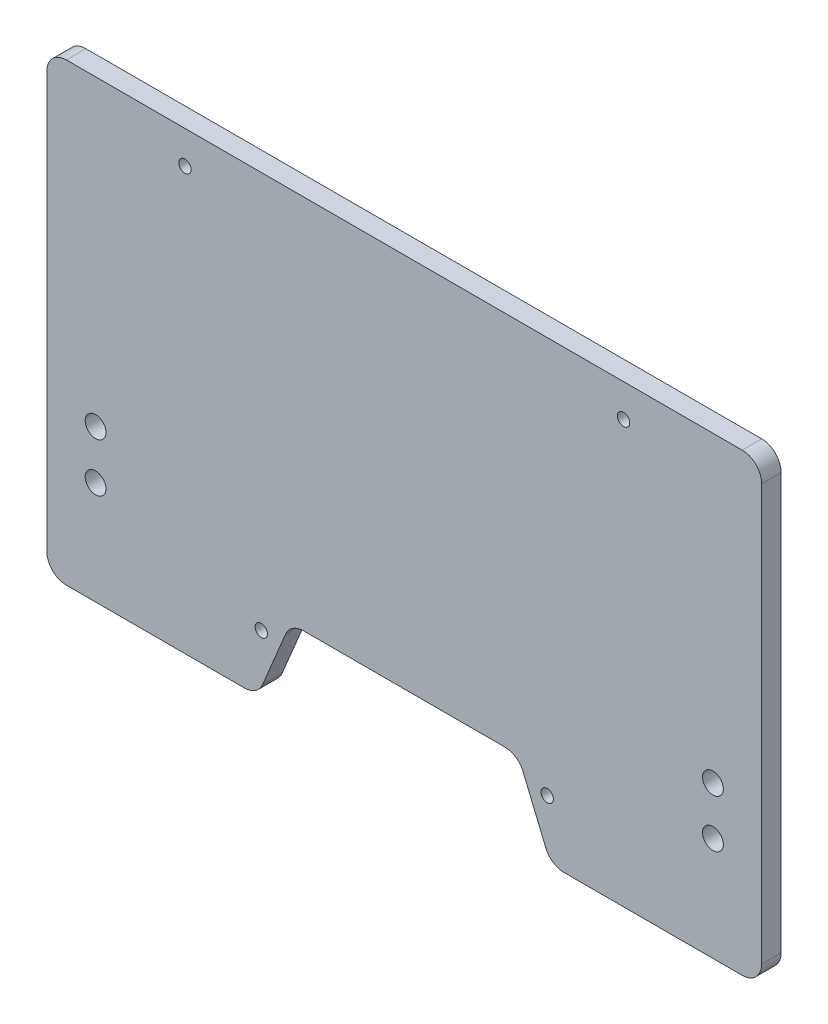
ISO-10303-21;
HEADER;
FILE_DESCRIPTION(('STEP AP214'),'2;1');
FILE_NAME('part.step','',(''),(''),'','','');
FILE_SCHEMA(('AUTOMOTIVE_DESIGN { 1 0 10303 214 1 1 1 1 }'));
ENDSEC;
DATA;
#1=APPLICATION_CONTEXT('core data for automotive mechanical design processes');
#2=APPLICATION_PROTOCOL_DEFINITION('international standard','automotive_design',2000,#1);
#3=PRODUCT_CONTEXT('',#1,'mechanical');
#4=PRODUCT('Part','Part','',(#3));
#5=PRODUCT_RELATED_PRODUCT_CATEGORY('part','',(#4));
#6=PRODUCT_DEFINITION_FORMATION('','',#4);
#7=PRODUCT_DEFINITION_CONTEXT('part definition',#1,'design');
#8=PRODUCT_DEFINITION('design','',#6,#7);
#9=PRODUCT_DEFINITION_SHAPE('','',#8);
#10=(LENGTH_UNIT() NAMED_UNIT(*) SI_UNIT(.MILLI.,.METRE.));
#11=(NAMED_UNIT(*) PLANE_ANGLE_UNIT() SI_UNIT($,.RADIAN.));
#12=(NAMED_UNIT(*) SI_UNIT($,.STERADIAN.) SOLID_ANGLE_UNIT());
#13=UNCERTAINTY_MEASURE_WITH_UNIT(LENGTH_MEASURE(1.E-05),#10,'distance_accuracy_value','');
#14=(GEOMETRIC_REPRESENTATION_CONTEXT(3) GLOBAL_UNCERTAINTY_ASSIGNED_CONTEXT((#13)) GLOBAL_UNIT_ASSIGNED_CONTEXT((#10,
#11,#12)) REPRESENTATION_CONTEXT('',''));
#15=CARTESIAN_POINT('',(0.,0.,0.));
#16=DIRECTION('',(0.,0.,1.));
#17=DIRECTION('',(1.,0.,0.));
#18=AXIS2_PLACEMENT_3D('',#15,#16,#17);
#19=CARTESIAN_POINT('',(99.5,78.1154273187962,3.));
#20=DIRECTION('',(0.,0.,-1.));
#21=DIRECTION('',(-1.,0.,0.));
#22=AXIS2_PLACEMENT_3D('',#19,#20,#21);
#23=PLANE('',#22);
#24=CARTESIAN_POINT('',(99.5,78.1154273187962,3.));
#25=DIRECTION('',(0.,0.,1.));
#26=DIRECTION('',(-1.,0.,0.));
#27=AXIS2_PLACEMENT_3D('',#24,#25,#26);
#28=CIRCLE('',#27,3.);
#29=CARTESIAN_POINT('',(102.5,78.1154273187962,3.));
#30=VERTEX_POINT('',#29);
#31=CARTESIAN_POINT('',(99.5,81.1154273187962,3.));
#32=VERTEX_POINT('',#31);
#33=EDGE_CURVE('E213',#30,#32,#28,.T.);
#34=ORIENTED_EDGE('',*,*,#33,.T.);
#35=DIRECTION('',(-1.,0.,0.));
#36=VECTOR('',#35,1.);
#37=CARTESIAN_POINT('',(-4.50000000000001,81.1154273187962,3.));
#38=LINE('',#37,#36);
#39=CARTESIAN_POINT('',(-4.50000000000001,81.1154273187962,3.));
#40=VERTEX_POINT('',#39);
#41=EDGE_CURVE('E119',#32,#40,#38,.T.);
#42=ORIENTED_EDGE('',*,*,#41,.T.);
#43=CARTESIAN_POINT('',(-4.50000000000001,78.1154273187962,3.));
#44=DIRECTION('',(0.,0.,1.));
#45=DIRECTION('',(1.,0.,0.));
#46=AXIS2_PLACEMENT_3D('',#43,#44,#45);
#47=CIRCLE('',#46,3.);
#48=CARTESIAN_POINT('',(-7.50000000000001,78.1154273187962,3.));
#49=VERTEX_POINT('',#48);
#50=EDGE_CURVE('E252',#40,#49,#47,.T.);
#51=ORIENTED_EDGE('',*,*,#50,.T.);
#52=DIRECTION('',(0.,-1.,0.));
#53=VECTOR('',#52,1.);
#54=CARTESIAN_POINT('',(-7.50000000000001,78.1154273187962,3.));
#55=LINE('',#54,#53);
#56=CARTESIAN_POINT('',(-7.5,14.1154273187962,3.));
#57=VERTEX_POINT('',#56);
#58=EDGE_CURVE('E271',#49,#57,#55,.T.);
#59=ORIENTED_EDGE('',*,*,#58,.T.);
#60=CARTESIAN_POINT('',(-4.5,14.1154273187962,3.));
#61=DIRECTION('',(0.,0.,1.));
#62=DIRECTION('',(1.,0.,0.));
#63=AXIS2_PLACEMENT_3D('',#60,#61,#62);
#64=CIRCLE('',#63,3.);
#65=CARTESIAN_POINT('',(-4.49999999999998,11.1154273187962,3.));
#66=VERTEX_POINT('',#65);
#67=EDGE_CURVE('E268',#57,#66,#64,.T.);
#68=ORIENTED_EDGE('',*,*,#67,.T.);
#69=DIRECTION('',(1.,0.,0.));
#70=VECTOR('',#69,1.);
#71=CARTESIAN_POINT('',(-4.49999999999998,11.1154273187962,3.));
#72=LINE('',#71,#70);
#73=CARTESIAN_POINT('',(22.9314636408157,11.1154273187962,3.));
#74=VERTEX_POINT('',#73);
#75=EDGE_CURVE('E270',#66,#74,#72,.T.);
#76=ORIENTED_EDGE('',*,*,#75,.T.);
#77=CARTESIAN_POINT('',(22.9314636408157,14.1154273187962,3.));
#78=DIRECTION('',(0.,0.,1.));
#79=DIRECTION('',(-1.,0.,0.));
#80=AXIS2_PLACEMENT_3D('',#77,#78,#79);
#81=CIRCLE('',#80,3.);
#82=CARTESIAN_POINT('',(25.7006944100464,12.9615811649499,3.));
#83=VERTEX_POINT('',#82);
#84=EDGE_CURVE('E273',#74,#83,#81,.T.);
#85=ORIENTED_EDGE('',*,*,#84,.T.);
#86=DIRECTION('',(0.384615384615421,0.923076923076908,0.));
#87=VECTOR('',#86,1.);
#88=CARTESIAN_POINT('',(28.2692307692299,19.1260684269896,3.));
#89=LINE('',#88,#87);
#90=CARTESIAN_POINT('',(29.2307692307699,21.4337607346855,3.));
#91=VERTEX_POINT('',#90);
#92=EDGE_CURVE('E279',#83,#91,#89,.T.);
#93=ORIENTED_EDGE('',*,*,#92,.T.);
#94=CARTESIAN_POINT('',(32.,20.2799145808375,3.));
#95=DIRECTION('',(0.,0.,-1.));
#96=DIRECTION('',(1.,0.,0.));
#97=AXIS2_PLACEMENT_3D('',#94,#95,#96);
#98=CIRCLE('',#97,3.00000000000002);
#99=CARTESIAN_POINT('',(32.,23.2799145808375,3.));
#100=VERTEX_POINT('',#99);
#101=EDGE_CURVE('E281',#91,#100,#98,.T.);
#102=ORIENTED_EDGE('',*,*,#101,.T.);
#103=DIRECTION('',(1.,0.,0.));
#104=VECTOR('',#103,1.);
#105=CARTESIAN_POINT('',(32.,23.2799145808375,3.));
#106=LINE('',#105,#104);
#107=CARTESIAN_POINT('',(63.,23.2799145808375,3.));
#108=VERTEX_POINT('',#107);
#109=EDGE_CURVE('E283',#100,#108,#106,.T.);
#110=ORIENTED_EDGE('',*,*,#109,.T.);
#111=CARTESIAN_POINT('',(63.,20.2799145808375,3.));
#112=DIRECTION('',(0.,0.,-1.));
#113=DIRECTION('',(1.,0.,0.));
#114=AXIS2_PLACEMENT_3D('',#111,#112,#113);
#115=CIRCLE('',#114,2.99999999999994);
#116=CARTESIAN_POINT('',(65.7692307692299,21.4337607346854,3.));
#117=VERTEX_POINT('',#116);
#118=EDGE_CURVE('E285',#108,#117,#115,.T.);
#119=ORIENTED_EDGE('',*,*,#118,.T.);
#120=DIRECTION('',(0.384615384615432,-0.923076923076903,0.));
#121=VECTOR('',#120,1.);
#122=CARTESIAN_POINT('',(65.7692307692299,21.4337607346854,3.));
#123=LINE('',#122,#121);
#124=CARTESIAN_POINT('',(69.2993055899535,12.9615811649499,3.));
#125=VERTEX_POINT('',#124);
#126=EDGE_CURVE('E287',#117,#125,#123,.T.);
#127=ORIENTED_EDGE('',*,*,#126,.T.);
#128=CARTESIAN_POINT('',(72.0685363591843,14.1154273187962,3.));
#129=DIRECTION('',(0.,0.,1.));
#130=DIRECTION('',(1.,0.,0.));
#131=AXIS2_PLACEMENT_3D('',#128,#129,#130);
#132=CIRCLE('',#131,3.);
#133=CARTESIAN_POINT('',(72.0685363591843,11.1154273187962,3.));
#134=VERTEX_POINT('',#133);
#135=EDGE_CURVE('E162',#125,#134,#132,.T.);
#136=ORIENTED_EDGE('',*,*,#135,.T.);
#137=DIRECTION('',(1.,0.,0.));
#138=VECTOR('',#137,1.);
#139=CARTESIAN_POINT('',(72.0685363591843,11.1154273187962,3.));
#140=LINE('',#139,#138);
#141=CARTESIAN_POINT('',(99.5,11.1154273187962,3.));
#142=VERTEX_POINT('',#141);
#143=EDGE_CURVE('E156',#134,#142,#140,.T.);
#144=ORIENTED_EDGE('',*,*,#143,.T.);
#145=CARTESIAN_POINT('',(99.5,14.1154273187962,3.));
#146=DIRECTION('',(0.,0.,1.));
#147=DIRECTION('',(1.,0.,0.));
#148=AXIS2_PLACEMENT_3D('',#145,#146,#147);
#149=CIRCLE('',#148,3.);
#150=CARTESIAN_POINT('',(102.5,14.1154273187962,3.));
#151=VERTEX_POINT('',#150);
#152=EDGE_CURVE('E160',#142,#151,#149,.T.);
#153=ORIENTED_EDGE('',*,*,#152,.T.);
#154=DIRECTION('',(0.,1.,0.));
#155=VECTOR('',#154,1.);
#156=CARTESIAN_POINT('',(102.5,78.1154273187962,3.));
#157=LINE('',#156,#155);
#158=EDGE_CURVE('E52',#151,#30,#157,.T.);
#159=ORIENTED_EDGE('',*,*,#158,.T.);
#160=EDGE_LOOP('',(#34,#42,#51,#59,#68,#76,#85,#93,#102,#110,#119,#127,#136,#144,#153,#159));
#161=FACE_BOUND('',#160,.T.);
#162=CARTESIAN_POINT('',(0.,34.4999999999959,3.));
#163=DIRECTION('',(0.,0.,1.));
#164=DIRECTION('',(1.,0.,0.));
#165=AXIS2_PLACEMENT_3D('',#162,#163,#164);
#166=CIRCLE('',#165,1.6);
#167=CARTESIAN_POINT('',(1.6,34.4999999999959,3.));
#168=VERTEX_POINT('',#167);
#169=EDGE_CURVE('E184',#168,#168,#166,.T.);
#170=ORIENTED_EDGE('',*,*,#169,.F.);
#171=EDGE_LOOP('',(#170));
#172=FACE_BOUND('',#171,.T.);
#173=CARTESIAN_POINT('',(0.,26.9999999999979,3.));
#174=DIRECTION('',(0.,0.,1.));
#175=DIRECTION('',(1.,0.,0.));
#176=AXIS2_PLACEMENT_3D('',#173,#174,#175);
#177=CIRCLE('',#176,1.6);
#178=CARTESIAN_POINT('',(1.6,26.9999999999979,3.));
#179=VERTEX_POINT('',#178);
#180=EDGE_CURVE('E390',#179,#179,#177,.T.);
#181=ORIENTED_EDGE('',*,*,#180,.F.);
#182=EDGE_LOOP('',(#181));
#183=FACE_BOUND('',#182,.T.);
#184=CARTESIAN_POINT('',(95.,34.4999999999959,3.));
#185=DIRECTION('',(0.,0.,1.));
#186=DIRECTION('',(1.,0.,0.));
#187=AXIS2_PLACEMENT_3D('',#184,#185,#186);
#188=CIRCLE('',#187,1.60000000000001);
#189=CARTESIAN_POINT('',(96.6,34.4999999999959,3.));
#190=VERTEX_POINT('',#189);
#191=EDGE_CURVE('E384',#190,#190,#188,.T.);
#192=ORIENTED_EDGE('',*,*,#191,.F.);
#193=EDGE_LOOP('',(#192));
#194=FACE_BOUND('',#193,.T.);
#195=CARTESIAN_POINT('',(95.,27.1000000000248,3.));
#196=DIRECTION('',(0.,0.,1.));
#197=DIRECTION('',(1.,0.,0.));
#198=AXIS2_PLACEMENT_3D('',#195,#196,#197);
#199=CIRCLE('',#198,1.6);
#200=CARTESIAN_POINT('',(96.6,27.1000000000248,3.));
#201=VERTEX_POINT('',#200);
#202=EDGE_CURVE('E378',#201,#201,#199,.T.);
#203=ORIENTED_EDGE('',*,*,#202,.F.);
#204=EDGE_LOOP('',(#203));
#205=FACE_BOUND('',#204,.T.);
#206=CARTESIAN_POINT('',(13.75,76.0799145808375,3.));
#207=DIRECTION('',(0.,0.,1.));
#208=DIRECTION('',(1.,0.,0.));
#209=AXIS2_PLACEMENT_3D('',#206,#207,#208);
#210=CIRCLE('',#209,0.950000000000001);
#211=CARTESIAN_POINT('',(14.7,76.0799145808375,3.));
#212=VERTEX_POINT('',#211);
#213=EDGE_CURVE('E372',#212,#212,#210,.T.);
#214=ORIENTED_EDGE('',*,*,#213,.F.);
#215=EDGE_LOOP('',(#214));
#216=FACE_BOUND('',#215,.T.);
#217=CARTESIAN_POINT('',(81.25,76.0799145808375,3.));
#218=DIRECTION('',(0.,0.,1.));
#219=DIRECTION('',(1.,0.,0.));
#220=AXIS2_PLACEMENT_3D('',#217,#218,#219);
#221=CIRCLE('',#220,0.950000000000003);
#222=CARTESIAN_POINT('',(82.2,76.0799145808375,3.));
#223=VERTEX_POINT('',#222);
#224=EDGE_CURVE('E366',#223,#223,#221,.T.);
#225=ORIENTED_EDGE('',*,*,#224,.F.);
#226=EDGE_LOOP('',(#225));
#227=FACE_BOUND('',#226,.T.);
#228=CARTESIAN_POINT('',(69.5,20.0799145808375,3.));
#229=DIRECTION('',(0.,0.,1.));
#230=DIRECTION('',(1.,0.,0.));
#231=AXIS2_PLACEMENT_3D('',#228,#229,#230);
#232=CIRCLE('',#231,0.950000000000002);
#233=CARTESIAN_POINT('',(70.45,20.0799145808375,3.));
#234=VERTEX_POINT('',#233);
#235=EDGE_CURVE('E360',#234,#234,#232,.T.);
#236=ORIENTED_EDGE('',*,*,#235,.F.);
#237=EDGE_LOOP('',(#236));
#238=FACE_BOUND('',#237,.T.);
#239=CARTESIAN_POINT('',(25.5,20.0799145808375,3.));
#240=DIRECTION('',(0.,0.,1.));
#241=DIRECTION('',(1.,0.,0.));
#242=AXIS2_PLACEMENT_3D('',#239,#240,#241);
#243=CIRCLE('',#242,0.950000000000001);
#244=CARTESIAN_POINT('',(26.45,20.0799145808375,3.));
#245=VERTEX_POINT('',#244);
#246=EDGE_CURVE('E351',#245,#245,#243,.T.);
#247=ORIENTED_EDGE('',*,*,#246,.F.);
#248=EDGE_LOOP('',(#247));
#249=FACE_BOUND('',#248,.T.);
#250=ADVANCED_FACE('F35',(#161,#172,#183,#194,#205,#216,#227,#238,#249),#23,.F.);
#251=CARTESIAN_POINT('',(99.5,78.1154273187962,0.));
#252=DIRECTION('',(0.,0.,-1.));
#253=DIRECTION('',(-1.,0.,0.));
#254=AXIS2_PLACEMENT_3D('',#251,#252,#253);
#255=PLANE('',#254);
#256=CARTESIAN_POINT('',(69.5,20.0799145808375,0.));
#257=DIRECTION('',(0.,0.,1.));
#258=DIRECTION('',(1.,0.,0.));
#259=AXIS2_PLACEMENT_3D('',#256,#257,#258);
#260=CIRCLE('',#259,0.950000000000002);
#261=CARTESIAN_POINT('',(70.45,20.0799145808375,0.));
#262=VERTEX_POINT('',#261);
#263=EDGE_CURVE('E357',#262,#262,#260,.T.);
#264=ORIENTED_EDGE('',*,*,#263,.T.);
#265=EDGE_LOOP('',(#264));
#266=FACE_BOUND('',#265,.T.);
#267=CARTESIAN_POINT('',(13.75,76.0799145808375,0.));
#268=DIRECTION('',(0.,0.,1.));
#269=DIRECTION('',(1.,0.,0.));
#270=AXIS2_PLACEMENT_3D('',#267,#268,#269);
#271=CIRCLE('',#270,0.950000000000001);
#272=CARTESIAN_POINT('',(14.7,76.0799145808375,0.));
#273=VERTEX_POINT('',#272);
#274=EDGE_CURVE('E369',#273,#273,#271,.T.);
#275=ORIENTED_EDGE('',*,*,#274,.T.);
#276=EDGE_LOOP('',(#275));
#277=FACE_BOUND('',#276,.T.);
#278=CARTESIAN_POINT('',(95.,34.4999999999959,0.));
#279=DIRECTION('',(0.,0.,1.));
#280=DIRECTION('',(1.,0.,0.));
#281=AXIS2_PLACEMENT_3D('',#278,#279,#280);
#282=CIRCLE('',#281,1.60000000000001);
#283=CARTESIAN_POINT('',(96.6,34.4999999999959,0.));
#284=VERTEX_POINT('',#283);
#285=EDGE_CURVE('E381',#284,#284,#282,.T.);
#286=ORIENTED_EDGE('',*,*,#285,.T.);
#287=EDGE_LOOP('',(#286));
#288=FACE_BOUND('',#287,.T.);
#289=CARTESIAN_POINT('',(0.,34.4999999999959,0.));
#290=DIRECTION('',(0.,0.,1.));
#291=DIRECTION('',(1.,0.,0.));
#292=AXIS2_PLACEMENT_3D('',#289,#290,#291);
#293=CIRCLE('',#292,1.6);
#294=CARTESIAN_POINT('',(1.6,34.4999999999959,0.));
#295=VERTEX_POINT('',#294);
#296=EDGE_CURVE('E393',#295,#295,#293,.T.);
#297=ORIENTED_EDGE('',*,*,#296,.T.);
#298=EDGE_LOOP('',(#297));
#299=FACE_BOUND('',#298,.T.);
#300=CARTESIAN_POINT('',(99.5,78.1154273187962,0.));
#301=DIRECTION('',(0.,0.,1.));
#302=DIRECTION('',(-1.,0.,0.));
#303=AXIS2_PLACEMENT_3D('',#300,#301,#302);
#304=CIRCLE('',#303,3.);
#305=CARTESIAN_POINT('',(102.5,78.1154273187962,0.));
#306=VERTEX_POINT('',#305);
#307=CARTESIAN_POINT('',(99.5,81.1154273187962,0.));
#308=VERTEX_POINT('',#307);
#309=EDGE_CURVE('E180',#306,#308,#304,.T.);
#310=ORIENTED_EDGE('',*,*,#309,.F.);
#311=DIRECTION('',(0.,1.,0.));
#312=VECTOR('',#311,1.);
#313=CARTESIAN_POINT('',(102.5,78.1154273187962,0.));
#314=LINE('',#313,#312);
#315=CARTESIAN_POINT('',(102.5,14.1154273187962,0.));
#316=VERTEX_POINT('',#315);
#317=EDGE_CURVE('E111',#316,#306,#314,.T.);
#318=ORIENTED_EDGE('',*,*,#317,.F.);
#319=CARTESIAN_POINT('',(99.5,14.1154273187962,0.));
#320=DIRECTION('',(0.,0.,1.));
#321=DIRECTION('',(1.,0.,0.));
#322=AXIS2_PLACEMENT_3D('',#319,#320,#321);
#323=CIRCLE('',#322,3.);
#324=CARTESIAN_POINT('',(99.5,11.1154273187962,0.));
#325=VERTEX_POINT('',#324);
#326=EDGE_CURVE('E105',#325,#316,#323,.T.);
#327=ORIENTED_EDGE('',*,*,#326,.F.);
#328=DIRECTION('',(1.,0.,0.));
#329=VECTOR('',#328,1.);
#330=CARTESIAN_POINT('',(72.0685363591843,11.1154273187962,0.));
#331=LINE('',#330,#329);
#332=CARTESIAN_POINT('',(72.0685363591843,11.1154273187962,0.));
#333=VERTEX_POINT('',#332);
#334=EDGE_CURVE('E170',#333,#325,#331,.T.);
#335=ORIENTED_EDGE('',*,*,#334,.F.);
#336=CARTESIAN_POINT('',(72.0685363591843,14.1154273187962,0.));
#337=DIRECTION('',(0.,0.,1.));
#338=DIRECTION('',(1.,0.,0.));
#339=AXIS2_PLACEMENT_3D('',#336,#337,#338);
#340=CIRCLE('',#339,3.);
#341=CARTESIAN_POINT('',(69.2993055899535,12.9615811649499,0.));
#342=VERTEX_POINT('',#341);
#343=EDGE_CURVE('E208',#342,#333,#340,.T.);
#344=ORIENTED_EDGE('',*,*,#343,.F.);
#345=DIRECTION('',(0.384615384615432,-0.923076923076903,0.));
#346=VECTOR('',#345,1.);
#347=CARTESIAN_POINT('',(66.7307692307682,19.1260684269938,0.));
#348=LINE('',#347,#346);
#349=CARTESIAN_POINT('',(65.7692307692299,21.4337607346854,0.));
#350=VERTEX_POINT('',#349);
#351=EDGE_CURVE('E206',#350,#342,#348,.T.);
#352=ORIENTED_EDGE('',*,*,#351,.F.);
#353=CARTESIAN_POINT('',(63.,20.2799145808375,0.));
#354=DIRECTION('',(0.,0.,-1.));
#355=DIRECTION('',(1.,0.,0.));
#356=AXIS2_PLACEMENT_3D('',#353,#354,#355);
#357=CIRCLE('',#356,2.99999999999994);
#358=CARTESIAN_POINT('',(63.,23.2799145808375,0.));
#359=VERTEX_POINT('',#358);
#360=EDGE_CURVE('E203',#359,#350,#357,.T.);
#361=ORIENTED_EDGE('',*,*,#360,.F.);
#362=DIRECTION('',(1.,0.,0.));
#363=VECTOR('',#362,1.);
#364=CARTESIAN_POINT('',(32.,23.2799145808375,0.));
#365=LINE('',#364,#363);
#366=CARTESIAN_POINT('',(32.,23.2799145808375,0.));
#367=VERTEX_POINT('',#366);
#368=EDGE_CURVE('E201',#367,#359,#365,.T.);
#369=ORIENTED_EDGE('',*,*,#368,.F.);
#370=CARTESIAN_POINT('',(32.,20.2799145808375,0.));
#371=DIRECTION('',(0.,0.,-1.));
#372=DIRECTION('',(1.,0.,0.));
#373=AXIS2_PLACEMENT_3D('',#370,#371,#372);
#374=CIRCLE('',#373,3.00000000000002);
#375=CARTESIAN_POINT('',(29.2307692307699,21.4337607346855,0.));
#376=VERTEX_POINT('',#375);
#377=EDGE_CURVE('E199',#376,#367,#374,.T.);
#378=ORIENTED_EDGE('',*,*,#377,.F.);
#379=DIRECTION('',(0.384615384615422,0.923076923076908,0.));
#380=VECTOR('',#379,1.);
#381=CARTESIAN_POINT('',(28.2692307692299,19.1260684269896,0.));
#382=LINE('',#381,#380);
#383=CARTESIAN_POINT('',(25.7006944100464,12.9615811649499,0.));
#384=VERTEX_POINT('',#383);
#385=EDGE_CURVE('E197',#384,#376,#382,.T.);
#386=ORIENTED_EDGE('',*,*,#385,.F.);
#387=CARTESIAN_POINT('',(22.9314636408157,14.1154273187962,0.));
#388=DIRECTION('',(0.,0.,1.));
#389=DIRECTION('',(-1.,0.,0.));
#390=AXIS2_PLACEMENT_3D('',#387,#388,#389);
#391=CIRCLE('',#390,3.);
#392=CARTESIAN_POINT('',(22.9314636408157,11.1154273187962,0.));
#393=VERTEX_POINT('',#392);
#394=EDGE_CURVE('E194',#393,#384,#391,.T.);
#395=ORIENTED_EDGE('',*,*,#394,.F.);
#396=DIRECTION('',(1.,0.,0.));
#397=VECTOR('',#396,1.);
#398=CARTESIAN_POINT('',(-4.49999999999998,11.1154273187962,0.));
#399=LINE('',#398,#397);
#400=CARTESIAN_POINT('',(-4.49999999999998,11.1154273187962,0.));
#401=VERTEX_POINT('',#400);
#402=EDGE_CURVE('E192',#401,#393,#399,.T.);
#403=ORIENTED_EDGE('',*,*,#402,.F.);
#404=CARTESIAN_POINT('',(-4.5,14.1154273187962,0.));
#405=DIRECTION('',(0.,0.,1.));
#406=DIRECTION('',(1.,0.,0.));
#407=AXIS2_PLACEMENT_3D('',#404,#405,#406);
#408=CIRCLE('',#407,3.);
#409=CARTESIAN_POINT('',(-7.5,14.1154273187962,0.));
#410=VERTEX_POINT('',#409);
#411=EDGE_CURVE('E190',#410,#401,#408,.T.);
#412=ORIENTED_EDGE('',*,*,#411,.F.);
#413=DIRECTION('',(0.,-1.,0.));
#414=VECTOR('',#413,1.);
#415=CARTESIAN_POINT('',(-7.50000000000001,78.1154273187962,0.));
#416=LINE('',#415,#414);
#417=CARTESIAN_POINT('',(-7.50000000000001,78.1154273187962,0.));
#418=VERTEX_POINT('',#417);
#419=EDGE_CURVE('E188',#418,#410,#416,.T.);
#420=ORIENTED_EDGE('',*,*,#419,.F.);
#421=CARTESIAN_POINT('',(-4.50000000000001,78.1154273187962,0.));
#422=DIRECTION('',(0.,0.,1.));
#423=DIRECTION('',(1.,0.,0.));
#424=AXIS2_PLACEMENT_3D('',#421,#422,#423);
#425=CIRCLE('',#424,3.);
#426=CARTESIAN_POINT('',(-4.50000000000001,81.1154273187962,0.));
#427=VERTEX_POINT('',#426);
#428=EDGE_CURVE('E186',#427,#418,#425,.T.);
#429=ORIENTED_EDGE('',*,*,#428,.F.);
#430=DIRECTION('',(-1.,0.,0.));
#431=VECTOR('',#430,1.);
#432=CARTESIAN_POINT('',(-4.50000000000001,81.1154273187962,0.));
#433=LINE('',#432,#431);
#434=EDGE_CURVE('E183',#308,#427,#433,.T.);
#435=ORIENTED_EDGE('',*,*,#434,.F.);
#436=EDGE_LOOP('',(#310,#318,#327,#335,#344,#352,#361,#369,#378,#386,#395,#403,#412,#420,#429,#435));
#437=FACE_BOUND('',#436,.T.);
#438=CARTESIAN_POINT('',(0.,26.9999999999979,0.));
#439=DIRECTION('',(0.,0.,1.));
#440=DIRECTION('',(1.,0.,0.));
#441=AXIS2_PLACEMENT_3D('',#438,#439,#440);
#442=CIRCLE('',#441,1.6);
#443=CARTESIAN_POINT('',(1.6,26.9999999999979,0.));
#444=VERTEX_POINT('',#443);
#445=EDGE_CURVE('E387',#444,#444,#442,.T.);
#446=ORIENTED_EDGE('',*,*,#445,.T.);
#447=EDGE_LOOP('',(#446));
#448=FACE_BOUND('',#447,.T.);
#449=CARTESIAN_POINT('',(95.,27.1000000000248,0.));
#450=DIRECTION('',(0.,0.,1.));
#451=DIRECTION('',(1.,0.,0.));
#452=AXIS2_PLACEMENT_3D('',#449,#450,#451);
#453=CIRCLE('',#452,1.6);
#454=CARTESIAN_POINT('',(96.6,27.1000000000248,0.));
#455=VERTEX_POINT('',#454);
#456=EDGE_CURVE('E375',#455,#455,#453,.T.);
#457=ORIENTED_EDGE('',*,*,#456,.T.);
#458=EDGE_LOOP('',(#457));
#459=FACE_BOUND('',#458,.T.);
#460=CARTESIAN_POINT('',(81.25,76.0799145808375,0.));
#461=DIRECTION('',(0.,0.,1.));
#462=DIRECTION('',(1.,0.,0.));
#463=AXIS2_PLACEMENT_3D('',#460,#461,#462);
#464=CIRCLE('',#463,0.950000000000003);
#465=CARTESIAN_POINT('',(82.2,76.0799145808375,0.));
#466=VERTEX_POINT('',#465);
#467=EDGE_CURVE('E363',#466,#466,#464,.T.);
#468=ORIENTED_EDGE('',*,*,#467,.T.);
#469=EDGE_LOOP('',(#468));
#470=FACE_BOUND('',#469,.T.);
#471=CARTESIAN_POINT('',(25.5,20.0799145808375,0.));
#472=DIRECTION('',(0.,0.,1.));
#473=DIRECTION('',(1.,0.,0.));
#474=AXIS2_PLACEMENT_3D('',#471,#472,#473);
#475=CIRCLE('',#474,0.950000000000001);
#476=CARTESIAN_POINT('',(26.45,20.0799145808375,0.));
#477=VERTEX_POINT('',#476);
#478=EDGE_CURVE('E354',#477,#477,#475,.T.);
#479=ORIENTED_EDGE('',*,*,#478,.T.);
#480=EDGE_LOOP('',(#479));
#481=FACE_BOUND('',#480,.T.);
#482=ADVANCED_FACE('F256',(#266,#277,#288,#299,#437,#448,#459,#470,#481),#255,.T.);
#483=CARTESIAN_POINT('',(99.5,78.1154273187962,3.));
#484=DIRECTION('',(0.,0.,-1.));
#485=DIRECTION('',(-1.,0.,0.));
#486=AXIS2_PLACEMENT_3D('',#483,#484,#485);
#487=CYLINDRICAL_SURFACE('',#486,3.);
#488=ORIENTED_EDGE('',*,*,#309,.T.);
#489=DIRECTION('',(0.,0.,-1.));
#490=VECTOR('',#489,1.);
#491=CARTESIAN_POINT('',(99.5,81.1154273187962,3.));
#492=LINE('',#491,#490);
#493=EDGE_CURVE('E11',#32,#308,#492,.T.);
#494=ORIENTED_EDGE('',*,*,#493,.F.);
#495=ORIENTED_EDGE('',*,*,#33,.F.);
#496=DIRECTION('',(0.,0.,-1.));
#497=VECTOR('',#496,1.);
#498=CARTESIAN_POINT('',(102.5,78.1154273187962,3.));
#499=LINE('',#498,#497);
#500=EDGE_CURVE('E176',#30,#306,#499,.T.);
#501=ORIENTED_EDGE('',*,*,#500,.T.);
#502=EDGE_LOOP('',(#488,#494,#495,#501));
#503=FACE_BOUND('',#502,.T.);
#504=ADVANCED_FACE('F37',(#503),#487,.T.);
#505=CARTESIAN_POINT('',(-4.50000000000001,81.1154273187962,3.));
#506=DIRECTION('',(0.,-1.,0.));
#507=DIRECTION('',(0.,0.,-1.));
#508=AXIS2_PLACEMENT_3D('',#505,#506,#507);
#509=PLANE('',#508);
#510=ORIENTED_EDGE('',*,*,#434,.T.);
#511=DIRECTION('',(0.,0.,-1.));
#512=VECTOR('',#511,1.);
#513=CARTESIAN_POINT('',(-4.50000000000001,81.1154273187962,3.));
#514=LINE('',#513,#512);
#515=EDGE_CURVE('E44',#40,#427,#514,.T.);
#516=ORIENTED_EDGE('',*,*,#515,.F.);
#517=ORIENTED_EDGE('',*,*,#41,.F.);
#518=ORIENTED_EDGE('',*,*,#493,.T.);
#519=EDGE_LOOP('',(#510,#516,#517,#518));
#520=FACE_BOUND('',#519,.T.);
#521=ADVANCED_FACE('F583',(#520),#509,.F.);
#522=CARTESIAN_POINT('',(-4.50000000000001,78.1154273187962,3.));
#523=DIRECTION('',(0.,0.,-1.));
#524=DIRECTION('',(-1.,0.,0.));
#525=AXIS2_PLACEMENT_3D('',#522,#523,#524);
#526=CYLINDRICAL_SURFACE('',#525,3.);
#527=ORIENTED_EDGE('',*,*,#428,.T.);
#528=DIRECTION('',(0.,0.,-1.));
#529=VECTOR('',#528,1.);
#530=CARTESIAN_POINT('',(-7.50000000000001,78.1154273187962,3.));
#531=LINE('',#530,#529);
#532=EDGE_CURVE('E244',#49,#418,#531,.T.);
#533=ORIENTED_EDGE('',*,*,#532,.F.);
#534=ORIENTED_EDGE('',*,*,#50,.F.);
#535=ORIENTED_EDGE('',*,*,#515,.T.);
#536=EDGE_LOOP('',(#527,#533,#534,#535));
#537=FACE_BOUND('',#536,.T.);
#538=ADVANCED_FACE('F250',(#537),#526,.T.);
#539=CARTESIAN_POINT('',(-7.50000000000001,78.1154273187962,3.));
#540=DIRECTION('',(1.,0.,0.));
#541=DIRECTION('',(0.,1.,0.));
#542=AXIS2_PLACEMENT_3D('',#539,#540,#541);
#543=PLANE('',#542);
#544=ORIENTED_EDGE('',*,*,#419,.T.);
#545=DIRECTION('',(0.,0.,-1.));
#546=VECTOR('',#545,1.);
#547=CARTESIAN_POINT('',(-7.5,14.1154273187962,3.));
#548=LINE('',#547,#546);
#549=EDGE_CURVE('E241',#57,#410,#548,.T.);
#550=ORIENTED_EDGE('',*,*,#549,.F.);
#551=ORIENTED_EDGE('',*,*,#58,.F.);
#552=ORIENTED_EDGE('',*,*,#532,.T.);
#553=EDGE_LOOP('',(#544,#550,#551,#552));
#554=FACE_BOUND('',#553,.T.);
#555=ADVANCED_FACE('F262',(#554),#543,.F.);
#556=CARTESIAN_POINT('',(-4.5,14.1154273187962,3.));
#557=DIRECTION('',(0.,0.,-1.));
#558=DIRECTION('',(-1.,0.,0.));
#559=AXIS2_PLACEMENT_3D('',#556,#557,#558);
#560=CYLINDRICAL_SURFACE('',#559,3.);
#561=ORIENTED_EDGE('',*,*,#411,.T.);
#562=DIRECTION('',(0.,0.,-1.));
#563=VECTOR('',#562,1.);
#564=CARTESIAN_POINT('',(-4.49999999999998,11.1154273187962,3.));
#565=LINE('',#564,#563);
#566=EDGE_CURVE('E238',#66,#401,#565,.T.);
#567=ORIENTED_EDGE('',*,*,#566,.F.);
#568=ORIENTED_EDGE('',*,*,#67,.F.);
#569=ORIENTED_EDGE('',*,*,#549,.T.);
#570=EDGE_LOOP('',(#561,#567,#568,#569));
#571=FACE_BOUND('',#570,.T.);
#572=ADVANCED_FACE('F266',(#571),#560,.T.);
#573=CARTESIAN_POINT('',(-4.49999999999998,11.1154273187962,3.));
#574=DIRECTION('',(0.,1.,0.));
#575=DIRECTION('',(0.,0.,1.));
#576=AXIS2_PLACEMENT_3D('',#573,#574,#575);
#577=PLANE('',#576);
#578=ORIENTED_EDGE('',*,*,#402,.T.);
#579=DIRECTION('',(0.,0.,-1.));
#580=VECTOR('',#579,1.);
#581=CARTESIAN_POINT('',(22.9314636408157,11.1154273187962,3.));
#582=LINE('',#581,#580);
#583=EDGE_CURVE('E235',#74,#393,#582,.T.);
#584=ORIENTED_EDGE('',*,*,#583,.F.);
#585=ORIENTED_EDGE('',*,*,#75,.F.);
#586=ORIENTED_EDGE('',*,*,#566,.T.);
#587=EDGE_LOOP('',(#578,#584,#585,#586));
#588=FACE_BOUND('',#587,.T.);
#589=ADVANCED_FACE('F548',(#588),#577,.F.);
#590=CARTESIAN_POINT('',(22.9314636408157,14.1154273187962,3.));
#591=DIRECTION('',(0.,0.,-1.));
#592=DIRECTION('',(-1.,0.,0.));
#593=AXIS2_PLACEMENT_3D('',#590,#591,#592);
#594=CYLINDRICAL_SURFACE('',#593,3.);
#595=ORIENTED_EDGE('',*,*,#394,.T.);
#596=DIRECTION('',(0.,0.,-1.));
#597=VECTOR('',#596,1.);
#598=CARTESIAN_POINT('',(25.7006944100464,12.9615811649499,3.));
#599=LINE('',#598,#597);
#600=EDGE_CURVE('E232',#83,#384,#599,.T.);
#601=ORIENTED_EDGE('',*,*,#600,.F.);
#602=ORIENTED_EDGE('',*,*,#84,.F.);
#603=ORIENTED_EDGE('',*,*,#583,.T.);
#604=EDGE_LOOP('',(#595,#601,#602,#603));
#605=FACE_BOUND('',#604,.T.);
#606=ADVANCED_FACE('F537',(#605),#594,.T.);
#607=CARTESIAN_POINT('',(28.2692307692299,19.1260684269896,3.));
#608=DIRECTION('',(-0.923076923076907,0.384615384615422,0.));
#609=DIRECTION('',(-0.384615384615422,-0.923076923076907,0.));
#610=AXIS2_PLACEMENT_3D('',#607,#608,#609);
#611=PLANE('',#610);
#612=ORIENTED_EDGE('',*,*,#385,.T.);
#613=DIRECTION('',(0.,0.,-1.));
#614=VECTOR('',#613,1.);
#615=CARTESIAN_POINT('',(29.2307692307699,21.4337607346855,3.));
#616=LINE('',#615,#614);
#617=EDGE_CURVE('E229',#91,#376,#616,.T.);
#618=ORIENTED_EDGE('',*,*,#617,.F.);
#619=ORIENTED_EDGE('',*,*,#92,.F.);
#620=ORIENTED_EDGE('',*,*,#600,.T.);
#621=EDGE_LOOP('',(#612,#618,#619,#620));
#622=FACE_BOUND('',#621,.T.);
#623=ADVANCED_FACE('F527',(#622),#611,.F.);
#624=CARTESIAN_POINT('',(32.,20.2799145808375,3.));
#625=DIRECTION('',(0.,0.,-1.));
#626=DIRECTION('',(-1.,0.,0.));
#627=AXIS2_PLACEMENT_3D('',#624,#625,#626);
#628=CYLINDRICAL_SURFACE('',#627,3.00000000000002);
#629=ORIENTED_EDGE('',*,*,#377,.T.);
#630=DIRECTION('',(0.,0.,-1.));
#631=VECTOR('',#630,1.);
#632=CARTESIAN_POINT('',(32.,23.2799145808375,3.));
#633=LINE('',#632,#631);
#634=EDGE_CURVE('E226',#100,#367,#633,.T.);
#635=ORIENTED_EDGE('',*,*,#634,.F.);
#636=ORIENTED_EDGE('',*,*,#101,.F.);
#637=ORIENTED_EDGE('',*,*,#617,.T.);
#638=EDGE_LOOP('',(#629,#635,#636,#637));
#639=FACE_BOUND('',#638,.T.);
#640=ADVANCED_FACE('F517',(#639),#628,.F.);
#641=CARTESIAN_POINT('',(32.,23.2799145808375,3.));
#642=DIRECTION('',(0.,1.,0.));
#643=DIRECTION('',(0.,0.,1.));
#644=AXIS2_PLACEMENT_3D('',#641,#642,#643);
#645=PLANE('',#644);
#646=ORIENTED_EDGE('',*,*,#368,.T.);
#647=DIRECTION('',(0.,0.,-1.));
#648=VECTOR('',#647,1.);
#649=CARTESIAN_POINT('',(63.,23.2799145808375,3.));
#650=LINE('',#649,#648);
#651=EDGE_CURVE('E223',#108,#359,#650,.T.);
#652=ORIENTED_EDGE('',*,*,#651,.F.);
#653=ORIENTED_EDGE('',*,*,#109,.F.);
#654=ORIENTED_EDGE('',*,*,#634,.T.);
#655=EDGE_LOOP('',(#646,#652,#653,#654));
#656=FACE_BOUND('',#655,.T.);
#657=ADVANCED_FACE('F507',(#656),#645,.F.);
#658=CARTESIAN_POINT('',(63.,20.2799145808375,3.));
#659=DIRECTION('',(0.,0.,-1.));
#660=DIRECTION('',(-1.,0.,0.));
#661=AXIS2_PLACEMENT_3D('',#658,#659,#660);
#662=CYLINDRICAL_SURFACE('',#661,2.99999999999994);
#663=ORIENTED_EDGE('',*,*,#360,.T.);
#664=DIRECTION('',(0.,0.,-1.));
#665=VECTOR('',#664,1.);
#666=CARTESIAN_POINT('',(65.7692307692299,21.4337607346854,3.));
#667=LINE('',#666,#665);
#668=EDGE_CURVE('E220',#117,#350,#667,.T.);
#669=ORIENTED_EDGE('',*,*,#668,.F.);
#670=ORIENTED_EDGE('',*,*,#118,.F.);
#671=ORIENTED_EDGE('',*,*,#651,.T.);
#672=EDGE_LOOP('',(#663,#669,#670,#671));
#673=FACE_BOUND('',#672,.T.);
#674=ADVANCED_FACE('F497',(#673),#662,.F.);
#675=CARTESIAN_POINT('',(66.7307692307682,19.1260684269938,3.));
#676=DIRECTION('',(0.923076923076903,0.384615384615432,0.));
#677=DIRECTION('',(-0.384615384615432,0.923076923076903,0.));
#678=AXIS2_PLACEMENT_3D('',#675,#676,#677);
#679=PLANE('',#678);
#680=ORIENTED_EDGE('',*,*,#351,.T.);
#681=DIRECTION('',(0.,0.,-1.));
#682=VECTOR('',#681,1.);
#683=CARTESIAN_POINT('',(69.2993055899535,12.9615811649499,3.));
#684=LINE('',#683,#682);
#685=EDGE_CURVE('E217',#125,#342,#684,.T.);
#686=ORIENTED_EDGE('',*,*,#685,.F.);
#687=ORIENTED_EDGE('',*,*,#126,.F.);
#688=ORIENTED_EDGE('',*,*,#668,.T.);
#689=EDGE_LOOP('',(#680,#686,#687,#688));
#690=FACE_BOUND('',#689,.T.);
#691=ADVANCED_FACE('F293',(#690),#679,.F.);
#692=CARTESIAN_POINT('',(72.0685363591843,14.1154273187962,3.));
#693=DIRECTION('',(0.,0.,-1.));
#694=DIRECTION('',(-1.,0.,0.));
#695=AXIS2_PLACEMENT_3D('',#692,#693,#694);
#696=CYLINDRICAL_SURFACE('',#695,3.);
#697=ORIENTED_EDGE('',*,*,#343,.T.);
#698=DIRECTION('',(0.,0.,-1.));
#699=VECTOR('',#698,1.);
#700=CARTESIAN_POINT('',(72.0685363591843,11.1154273187962,3.));
#701=LINE('',#700,#699);
#702=EDGE_CURVE('E171',#134,#333,#701,.T.);
#703=ORIENTED_EDGE('',*,*,#702,.F.);
#704=ORIENTED_EDGE('',*,*,#135,.F.);
#705=ORIENTED_EDGE('',*,*,#685,.T.);
#706=EDGE_LOOP('',(#697,#703,#704,#705));
#707=FACE_BOUND('',#706,.T.);
#708=ADVANCED_FACE('F296',(#707),#696,.T.);
#709=CARTESIAN_POINT('',(72.0685363591843,11.1154273187962,3.));
#710=DIRECTION('',(0.,1.,0.));
#711=DIRECTION('',(-1.,0.,0.));
#712=AXIS2_PLACEMENT_3D('',#709,#710,#711);
#713=PLANE('',#712);
#714=ORIENTED_EDGE('',*,*,#334,.T.);
#715=DIRECTION('',(0.,0.,-1.));
#716=VECTOR('',#715,1.);
#717=CARTESIAN_POINT('',(99.5,11.1154273187962,3.));
#718=LINE('',#717,#716);
#719=EDGE_CURVE('E167',#142,#325,#718,.T.);
#720=ORIENTED_EDGE('',*,*,#719,.F.);
#721=ORIENTED_EDGE('',*,*,#143,.F.);
#722=ORIENTED_EDGE('',*,*,#702,.T.);
#723=EDGE_LOOP('',(#714,#720,#721,#722));
#724=FACE_BOUND('',#723,.T.);
#725=ADVANCED_FACE('F168',(#724),#713,.F.);
#726=CARTESIAN_POINT('',(99.5,14.1154273187962,3.));
#727=DIRECTION('',(0.,0.,-1.));
#728=DIRECTION('',(-1.,0.,0.));
#729=AXIS2_PLACEMENT_3D('',#726,#727,#728);
#730=CYLINDRICAL_SURFACE('',#729,3.);
#731=ORIENTED_EDGE('',*,*,#326,.T.);
#732=DIRECTION('',(0.,0.,-1.));
#733=VECTOR('',#732,1.);
#734=CARTESIAN_POINT('',(102.5,14.1154273187962,3.));
#735=LINE('',#734,#733);
#736=EDGE_CURVE('E172',#151,#316,#735,.T.);
#737=ORIENTED_EDGE('',*,*,#736,.F.);
#738=ORIENTED_EDGE('',*,*,#152,.F.);
#739=ORIENTED_EDGE('',*,*,#719,.T.);
#740=EDGE_LOOP('',(#731,#737,#738,#739));
#741=FACE_BOUND('',#740,.T.);
#742=ADVANCED_FACE('F174',(#741),#730,.T.);
#743=CARTESIAN_POINT('',(102.5,78.1154273187962,3.));
#744=DIRECTION('',(-1.,0.,0.));
#745=DIRECTION('',(0.,-1.,0.));
#746=AXIS2_PLACEMENT_3D('',#743,#744,#745);
#747=PLANE('',#746);
#748=ORIENTED_EDGE('',*,*,#317,.T.);
#749=ORIENTED_EDGE('',*,*,#500,.F.);
#750=ORIENTED_EDGE('',*,*,#158,.F.);
#751=ORIENTED_EDGE('',*,*,#736,.T.);
#752=EDGE_LOOP('',(#748,#749,#750,#751));
#753=FACE_BOUND('',#752,.T.);
#754=ADVANCED_FACE('F300',(#753),#747,.F.);
#755=CARTESIAN_POINT('',(0.,34.4999999999959,3.));
#756=DIRECTION('',(0.,0.,-1.));
#757=DIRECTION('',(-1.,0.,0.));
#758=AXIS2_PLACEMENT_3D('',#755,#756,#757);
#759=CYLINDRICAL_SURFACE('',#758,1.6);
#760=ORIENTED_EDGE('',*,*,#169,.T.);
#761=EDGE_LOOP('',(#760));
#762=FACE_BOUND('',#761,.T.);
#763=ORIENTED_EDGE('',*,*,#296,.F.);
#764=EDGE_LOOP('',(#763));
#765=FACE_BOUND('',#764,.T.);
#766=ADVANCED_FACE('F302',(#762,#765),#759,.F.);
#767=CARTESIAN_POINT('',(0.,26.9999999999979,3.));
#768=DIRECTION('',(0.,0.,-1.));
#769=DIRECTION('',(-1.,0.,0.));
#770=AXIS2_PLACEMENT_3D('',#767,#768,#769);
#771=CYLINDRICAL_SURFACE('',#770,1.6);
#772=ORIENTED_EDGE('',*,*,#180,.T.);
#773=EDGE_LOOP('',(#772));
#774=FACE_BOUND('',#773,.T.);
#775=ORIENTED_EDGE('',*,*,#445,.F.);
#776=EDGE_LOOP('',(#775));
#777=FACE_BOUND('',#776,.T.);
#778=ADVANCED_FACE('F308',(#774,#777),#771,.F.);
#779=CARTESIAN_POINT('',(95.,34.4999999999959,3.));
#780=DIRECTION('',(0.,0.,-1.));
#781=DIRECTION('',(-1.,0.,0.));
#782=AXIS2_PLACEMENT_3D('',#779,#780,#781);
#783=CYLINDRICAL_SURFACE('',#782,1.60000000000001);
#784=ORIENTED_EDGE('',*,*,#191,.T.);
#785=EDGE_LOOP('',(#784));
#786=FACE_BOUND('',#785,.T.);
#787=ORIENTED_EDGE('',*,*,#285,.F.);
#788=EDGE_LOOP('',(#787));
#789=FACE_BOUND('',#788,.T.);
#790=ADVANCED_FACE('F322',(#786,#789),#783,.F.);
#791=CARTESIAN_POINT('',(95.,27.1000000000248,3.));
#792=DIRECTION('',(0.,0.,-1.));
#793=DIRECTION('',(-1.,0.,0.));
#794=AXIS2_PLACEMENT_3D('',#791,#792,#793);
#795=CYLINDRICAL_SURFACE('',#794,1.6);
#796=ORIENTED_EDGE('',*,*,#202,.T.);
#797=EDGE_LOOP('',(#796));
#798=FACE_BOUND('',#797,.T.);
#799=ORIENTED_EDGE('',*,*,#456,.F.);
#800=EDGE_LOOP('',(#799));
#801=FACE_BOUND('',#800,.T.);
#802=ADVANCED_FACE('F326',(#798,#801),#795,.F.);
#803=CARTESIAN_POINT('',(13.75,76.0799145808375,3.));
#804=DIRECTION('',(0.,0.,-1.));
#805=DIRECTION('',(-1.,0.,0.));
#806=AXIS2_PLACEMENT_3D('',#803,#804,#805);
#807=CYLINDRICAL_SURFACE('',#806,0.950000000000001);
#808=ORIENTED_EDGE('',*,*,#213,.T.);
#809=EDGE_LOOP('',(#808));
#810=FACE_BOUND('',#809,.T.);
#811=ORIENTED_EDGE('',*,*,#274,.F.);
#812=EDGE_LOOP('',(#811));
#813=FACE_BOUND('',#812,.T.);
#814=ADVANCED_FACE('F330',(#810,#813),#807,.F.);
#815=CARTESIAN_POINT('',(81.25,76.0799145808375,3.));
#816=DIRECTION('',(0.,0.,-1.));
#817=DIRECTION('',(-1.,0.,0.));
#818=AXIS2_PLACEMENT_3D('',#815,#816,#817);
#819=CYLINDRICAL_SURFACE('',#818,0.950000000000003);
#820=ORIENTED_EDGE('',*,*,#224,.T.);
#821=EDGE_LOOP('',(#820));
#822=FACE_BOUND('',#821,.T.);
#823=ORIENTED_EDGE('',*,*,#467,.F.);
#824=EDGE_LOOP('',(#823));
#825=FACE_BOUND('',#824,.T.);
#826=ADVANCED_FACE('F334',(#822,#825),#819,.F.);
#827=CARTESIAN_POINT('',(69.5,20.0799145808375,3.));
#828=DIRECTION('',(0.,0.,-1.));
#829=DIRECTION('',(-1.,0.,0.));
#830=AXIS2_PLACEMENT_3D('',#827,#828,#829);
#831=CYLINDRICAL_SURFACE('',#830,0.950000000000002);
#832=ORIENTED_EDGE('',*,*,#235,.T.);
#833=EDGE_LOOP('',(#832));
#834=FACE_BOUND('',#833,.T.);
#835=ORIENTED_EDGE('',*,*,#263,.F.);
#836=EDGE_LOOP('',(#835));
#837=FACE_BOUND('',#836,.T.);
#838=ADVANCED_FACE('F338',(#834,#837),#831,.F.);
#839=CARTESIAN_POINT('',(25.5,20.0799145808375,3.));
#840=DIRECTION('',(0.,0.,-1.));
#841=DIRECTION('',(-1.,0.,0.));
#842=AXIS2_PLACEMENT_3D('',#839,#840,#841);
#843=CYLINDRICAL_SURFACE('',#842,0.950000000000001);
#844=ORIENTED_EDGE('',*,*,#246,.T.);
#845=EDGE_LOOP('',(#844));
#846=FACE_BOUND('',#845,.T.);
#847=ORIENTED_EDGE('',*,*,#478,.F.);
#848=EDGE_LOOP('',(#847));
#849=FACE_BOUND('',#848,.T.);
#850=ADVANCED_FACE('F342',(#846,#849),#843,.F.);
#851=CLOSED_SHELL('',(#250,#482,#504,#521,#538,#555,#572,#589,#606,#623,#640,#657,#674,#691,
#708,#725,#742,#754,#766,#778,#790,#802,#814,#826,#838,#850));
#852=MANIFOLD_SOLID_BREP('B2',#851);
#853=ADVANCED_BREP_SHAPE_REPRESENTATION('',(#18,#852),#14);
#854=SHAPE_DEFINITION_REPRESENTATION(#9,#853);
ENDSEC;
END-ISO-10303-21;
